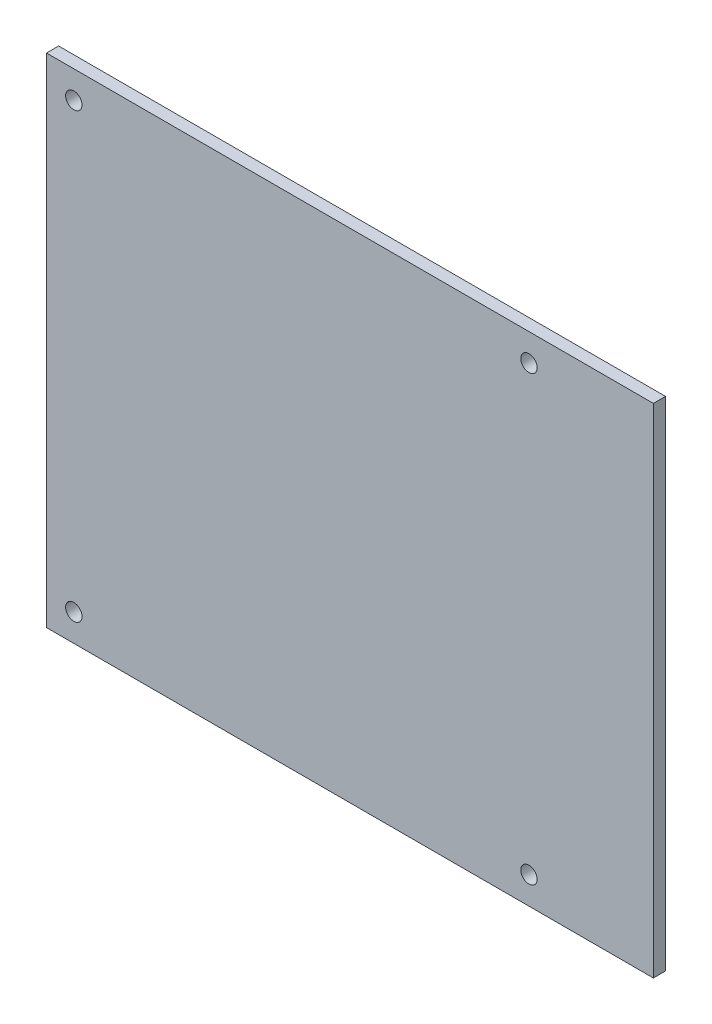
ISO-10303-21;
HEADER;
FILE_DESCRIPTION(('STEP AP214'),'2;1');
FILE_NAME('part.step','',(''),(''),'','','');
FILE_SCHEMA(('AUTOMOTIVE_DESIGN { 1 0 10303 214 1 1 1 1 }'));
ENDSEC;
DATA;
#1=APPLICATION_CONTEXT('core data for automotive mechanical design processes');
#2=APPLICATION_PROTOCOL_DEFINITION('international standard','automotive_design',2000,#1);
#3=PRODUCT_CONTEXT('',#1,'mechanical');
#4=PRODUCT('Part','Part','',(#3));
#5=PRODUCT_RELATED_PRODUCT_CATEGORY('part','',(#4));
#6=PRODUCT_DEFINITION_FORMATION('','',#4);
#7=PRODUCT_DEFINITION_CONTEXT('part definition',#1,'design');
#8=PRODUCT_DEFINITION('design','',#6,#7);
#9=PRODUCT_DEFINITION_SHAPE('','',#8);
#10=(LENGTH_UNIT() NAMED_UNIT(*) SI_UNIT(.MILLI.,.METRE.));
#11=(NAMED_UNIT(*) PLANE_ANGLE_UNIT() SI_UNIT($,.RADIAN.));
#12=(NAMED_UNIT(*) SI_UNIT($,.STERADIAN.) SOLID_ANGLE_UNIT());
#13=UNCERTAINTY_MEASURE_WITH_UNIT(LENGTH_MEASURE(1.E-05),#10,'distance_accuracy_value','');
#14=(GEOMETRIC_REPRESENTATION_CONTEXT(3) GLOBAL_UNCERTAINTY_ASSIGNED_CONTEXT((#13)) GLOBAL_UNIT_ASSIGNED_CONTEXT((#10,
#11,#12)) REPRESENTATION_CONTEXT('',''));
#15=CARTESIAN_POINT('',(0.,0.,0.));
#16=DIRECTION('',(0.,0.,1.));
#17=DIRECTION('',(1.,0.,0.));
#18=AXIS2_PLACEMENT_3D('',#15,#16,#17);
#19=CARTESIAN_POINT('',(0.,0.,52.5000000000001));
#20=DIRECTION('',(0.,0.,1.));
#21=DIRECTION('',(1.,0.,0.));
#22=AXIS2_PLACEMENT_3D('',#19,#20,#21);
#23=PLANE('',#22);
#24=CARTESIAN_POINT('',(38.8611652351687,-91.3,52.5000000000001));
#25=DIRECTION('',(0.,0.,1.));
#26=DIRECTION('',(1.,0.,0.));
#27=AXIS2_PLACEMENT_3D('',#24,#25,#26);
#28=CIRCLE('',#27,1.34999999999999);
#29=CARTESIAN_POINT('',(40.2111652351687,-91.3,52.5000000000001));
#30=VERTEX_POINT('',#29);
#31=EDGE_CURVE('E127',#30,#30,#28,.T.);
#32=ORIENTED_EDGE('',*,*,#31,.F.);
#33=EDGE_LOOP('',(#32));
#34=FACE_BOUND('',#33,.T.);
#35=CARTESIAN_POINT('',(-36.1388347648313,-91.3,52.5000000000001));
#36=DIRECTION('',(0.,0.,1.));
#37=DIRECTION('',(1.,0.,0.));
#38=AXIS2_PLACEMENT_3D('',#35,#36,#37);
#39=CIRCLE('',#38,1.34999999999999);
#40=CARTESIAN_POINT('',(-34.7888347648313,-91.3,52.5000000000001));
#41=VERTEX_POINT('',#40);
#42=EDGE_CURVE('E106',#41,#41,#39,.T.);
#43=ORIENTED_EDGE('',*,*,#42,.F.);
#44=EDGE_LOOP('',(#43));
#45=FACE_BOUND('',#44,.T.);
#46=DIRECTION('',(0.,-1.,0.));
#47=VECTOR('',#46,1.);
#48=CARTESIAN_POINT('',(-40.6388347648313,-13.8,52.5000000000001));
#49=LINE('',#48,#47);
#50=CARTESIAN_POINT('',(-40.6388347648313,-13.8,52.5000000000001));
#51=VERTEX_POINT('',#50);
#52=CARTESIAN_POINT('',(-40.6388347648313,-95.8,52.5000000000001));
#53=VERTEX_POINT('',#52);
#54=EDGE_CURVE('E91',#51,#53,#49,.T.);
#55=ORIENTED_EDGE('',*,*,#54,.T.);
#56=DIRECTION('',(1.,0.,0.));
#57=VECTOR('',#56,1.);
#58=CARTESIAN_POINT('',(-40.6388347648313,-95.8,52.5000000000001));
#59=LINE('',#58,#57);
#60=CARTESIAN_POINT('',(59.3611652351687,-95.8,52.5000000000001));
#61=VERTEX_POINT('',#60);
#62=EDGE_CURVE('E86',#53,#61,#59,.T.);
#63=ORIENTED_EDGE('',*,*,#62,.T.);
#64=DIRECTION('',(0.,1.,0.));
#65=VECTOR('',#64,1.);
#66=CARTESIAN_POINT('',(59.3611652351687,-13.8,52.5000000000001));
#67=LINE('',#66,#65);
#68=CARTESIAN_POINT('',(59.3611652351687,-13.8,52.5000000000001));
#69=VERTEX_POINT('',#68);
#70=EDGE_CURVE('E89',#61,#69,#67,.T.);
#71=ORIENTED_EDGE('',*,*,#70,.T.);
#72=DIRECTION('',(-1.,0.,0.));
#73=VECTOR('',#72,1.);
#74=CARTESIAN_POINT('',(-40.6388347648313,-13.8,52.5000000000001));
#75=LINE('',#74,#73);
#76=EDGE_CURVE('E56',#69,#51,#75,.T.);
#77=ORIENTED_EDGE('',*,*,#76,.T.);
#78=EDGE_LOOP('',(#55,#63,#71,#77));
#79=FACE_BOUND('',#78,.T.);
#80=CARTESIAN_POINT('',(-36.1388347648313,-18.3,52.5000000000001));
#81=DIRECTION('',(0.,0.,1.));
#82=DIRECTION('',(1.,0.,0.));
#83=AXIS2_PLACEMENT_3D('',#80,#81,#82);
#84=CIRCLE('',#83,1.35);
#85=CARTESIAN_POINT('',(-34.7888347648313,-18.3,52.5000000000001));
#86=VERTEX_POINT('',#85);
#87=EDGE_CURVE('E121',#86,#86,#84,.T.);
#88=ORIENTED_EDGE('',*,*,#87,.F.);
#89=EDGE_LOOP('',(#88));
#90=FACE_BOUND('',#89,.T.);
#91=CARTESIAN_POINT('',(38.8611652351687,-18.3,52.5000000000001));
#92=DIRECTION('',(0.,0.,1.));
#93=DIRECTION('',(1.,0.,0.));
#94=AXIS2_PLACEMENT_3D('',#91,#92,#93);
#95=CIRCLE('',#94,1.35);
#96=CARTESIAN_POINT('',(40.2111652351687,-18.3,52.5000000000001));
#97=VERTEX_POINT('',#96);
#98=EDGE_CURVE('E133',#97,#97,#95,.T.);
#99=ORIENTED_EDGE('',*,*,#98,.F.);
#100=EDGE_LOOP('',(#99));
#101=FACE_BOUND('',#100,.T.);
#102=ADVANCED_FACE('F39',(#34,#45,#79,#90,#101),#23,.T.);
#103=CARTESIAN_POINT('',(0.,0.,50.5));
#104=DIRECTION('',(0.,0.,1.));
#105=DIRECTION('',(1.,0.,0.));
#106=AXIS2_PLACEMENT_3D('',#103,#104,#105);
#107=PLANE('',#106);
#108=DIRECTION('',(0.,-1.,0.));
#109=VECTOR('',#108,1.);
#110=CARTESIAN_POINT('',(-40.6388347648313,-13.8,50.5));
#111=LINE('',#110,#109);
#112=CARTESIAN_POINT('',(-40.6388347648313,-13.8,50.5));
#113=VERTEX_POINT('',#112);
#114=CARTESIAN_POINT('',(-40.6388347648313,-95.8,50.5));
#115=VERTEX_POINT('',#114);
#116=EDGE_CURVE('E103',#113,#115,#111,.T.);
#117=ORIENTED_EDGE('',*,*,#116,.F.);
#118=DIRECTION('',(-1.,0.,0.));
#119=VECTOR('',#118,1.);
#120=CARTESIAN_POINT('',(-40.6388347648313,-13.8,50.5));
#121=LINE('',#120,#119);
#122=CARTESIAN_POINT('',(59.3611652351687,-13.8,50.5));
#123=VERTEX_POINT('',#122);
#124=EDGE_CURVE('E79',#123,#113,#121,.T.);
#125=ORIENTED_EDGE('',*,*,#124,.F.);
#126=DIRECTION('',(0.,1.,0.));
#127=VECTOR('',#126,1.);
#128=CARTESIAN_POINT('',(59.3611652351687,-13.8,50.5));
#129=LINE('',#128,#127);
#130=CARTESIAN_POINT('',(59.3611652351687,-95.8,50.5));
#131=VERTEX_POINT('',#130);
#132=EDGE_CURVE('E73',#131,#123,#129,.T.);
#133=ORIENTED_EDGE('',*,*,#132,.F.);
#134=DIRECTION('',(1.,0.,0.));
#135=VECTOR('',#134,1.);
#136=CARTESIAN_POINT('',(-40.6388347648313,-95.8,50.5));
#137=LINE('',#136,#135);
#138=EDGE_CURVE('E95',#115,#131,#137,.T.);
#139=ORIENTED_EDGE('',*,*,#138,.F.);
#140=EDGE_LOOP('',(#117,#125,#133,#139));
#141=FACE_BOUND('',#140,.T.);
#142=CARTESIAN_POINT('',(-36.1388347648313,-91.3,50.5));
#143=DIRECTION('',(0.,0.,1.));
#144=DIRECTION('',(1.,0.,0.));
#145=AXIS2_PLACEMENT_3D('',#142,#143,#144);
#146=CIRCLE('',#145,1.34999999999999);
#147=CARTESIAN_POINT('',(-34.7888347648313,-91.3,50.5));
#148=VERTEX_POINT('',#147);
#149=EDGE_CURVE('E118',#148,#148,#146,.T.);
#150=ORIENTED_EDGE('',*,*,#149,.T.);
#151=EDGE_LOOP('',(#150));
#152=FACE_BOUND('',#151,.T.);
#153=CARTESIAN_POINT('',(-36.1388347648313,-18.3,50.5));
#154=DIRECTION('',(0.,0.,1.));
#155=DIRECTION('',(1.,0.,0.));
#156=AXIS2_PLACEMENT_3D('',#153,#154,#155);
#157=CIRCLE('',#156,1.35);
#158=CARTESIAN_POINT('',(-34.7888347648313,-18.3,50.5));
#159=VERTEX_POINT('',#158);
#160=EDGE_CURVE('E124',#159,#159,#157,.T.);
#161=ORIENTED_EDGE('',*,*,#160,.T.);
#162=EDGE_LOOP('',(#161));
#163=FACE_BOUND('',#162,.T.);
#164=CARTESIAN_POINT('',(38.8611652351687,-91.3,50.5));
#165=DIRECTION('',(0.,0.,1.));
#166=DIRECTION('',(1.,0.,0.));
#167=AXIS2_PLACEMENT_3D('',#164,#165,#166);
#168=CIRCLE('',#167,1.34999999999999);
#169=CARTESIAN_POINT('',(40.2111652351687,-91.3,50.5));
#170=VERTEX_POINT('',#169);
#171=EDGE_CURVE('E130',#170,#170,#168,.T.);
#172=ORIENTED_EDGE('',*,*,#171,.T.);
#173=EDGE_LOOP('',(#172));
#174=FACE_BOUND('',#173,.T.);
#175=CARTESIAN_POINT('',(38.8611652351687,-18.3,50.5));
#176=DIRECTION('',(0.,0.,1.));
#177=DIRECTION('',(1.,0.,0.));
#178=AXIS2_PLACEMENT_3D('',#175,#176,#177);
#179=CIRCLE('',#178,1.35);
#180=CARTESIAN_POINT('',(40.2111652351687,-18.3,50.5));
#181=VERTEX_POINT('',#180);
#182=EDGE_CURVE('E136',#181,#181,#179,.T.);
#183=ORIENTED_EDGE('',*,*,#182,.T.);
#184=EDGE_LOOP('',(#183));
#185=FACE_BOUND('',#184,.T.);
#186=ADVANCED_FACE('F114',(#141,#152,#163,#174,#185),#107,.F.);
#187=CARTESIAN_POINT('',(-40.6388347648313,-13.8,52.5000000000001));
#188=DIRECTION('',(1.,0.,0.));
#189=DIRECTION('',(0.,0.,-1.));
#190=AXIS2_PLACEMENT_3D('',#187,#188,#189);
#191=PLANE('',#190);
#192=ORIENTED_EDGE('',*,*,#116,.T.);
#193=DIRECTION('',(0.,0.,-1.));
#194=VECTOR('',#193,1.);
#195=CARTESIAN_POINT('',(-40.6388347648313,-95.8,52.5000000000001));
#196=LINE('',#195,#194);
#197=EDGE_CURVE('E11',#53,#115,#196,.T.);
#198=ORIENTED_EDGE('',*,*,#197,.F.);
#199=ORIENTED_EDGE('',*,*,#54,.F.);
#200=DIRECTION('',(0.,0.,-1.));
#201=VECTOR('',#200,1.);
#202=CARTESIAN_POINT('',(-40.6388347648313,-13.8,52.5000000000001));
#203=LINE('',#202,#201);
#204=EDGE_CURVE('E99',#51,#113,#203,.T.);
#205=ORIENTED_EDGE('',*,*,#204,.T.);
#206=EDGE_LOOP('',(#192,#198,#199,#205));
#207=FACE_BOUND('',#206,.T.);
#208=ADVANCED_FACE('F41',(#207),#191,.F.);
#209=CARTESIAN_POINT('',(-40.6388347648313,-95.8,52.5000000000001));
#210=DIRECTION('',(0.,1.,0.));
#211=DIRECTION('',(0.,0.,1.));
#212=AXIS2_PLACEMENT_3D('',#209,#210,#211);
#213=PLANE('',#212);
#214=ORIENTED_EDGE('',*,*,#138,.T.);
#215=DIRECTION('',(0.,0.,-1.));
#216=VECTOR('',#215,1.);
#217=CARTESIAN_POINT('',(59.3611652351687,-95.8,52.5000000000001));
#218=LINE('',#217,#216);
#219=EDGE_CURVE('E48',#61,#131,#218,.T.);
#220=ORIENTED_EDGE('',*,*,#219,.F.);
#221=ORIENTED_EDGE('',*,*,#62,.F.);
#222=ORIENTED_EDGE('',*,*,#197,.T.);
#223=EDGE_LOOP('',(#214,#220,#221,#222));
#224=FACE_BOUND('',#223,.T.);
#225=ADVANCED_FACE('F94',(#224),#213,.F.);
#226=CARTESIAN_POINT('',(59.3611652351687,-13.8,52.5000000000001));
#227=DIRECTION('',(-1.,0.,0.));
#228=DIRECTION('',(0.,0.,1.));
#229=AXIS2_PLACEMENT_3D('',#226,#227,#228);
#230=PLANE('',#229);
#231=ORIENTED_EDGE('',*,*,#132,.T.);
#232=DIRECTION('',(0.,0.,-1.));
#233=VECTOR('',#232,1.);
#234=CARTESIAN_POINT('',(59.3611652351687,-13.8,52.5000000000001));
#235=LINE('',#234,#233);
#236=EDGE_CURVE('E96',#69,#123,#235,.T.);
#237=ORIENTED_EDGE('',*,*,#236,.F.);
#238=ORIENTED_EDGE('',*,*,#70,.F.);
#239=ORIENTED_EDGE('',*,*,#219,.T.);
#240=EDGE_LOOP('',(#231,#237,#238,#239));
#241=FACE_BOUND('',#240,.T.);
#242=ADVANCED_FACE('F97',(#241),#230,.F.);
#243=CARTESIAN_POINT('',(-40.6388347648313,-13.8,52.5000000000001));
#244=DIRECTION('',(0.,-1.,0.));
#245=DIRECTION('',(0.,0.,-1.));
#246=AXIS2_PLACEMENT_3D('',#243,#244,#245);
#247=PLANE('',#246);
#248=ORIENTED_EDGE('',*,*,#124,.T.);
#249=ORIENTED_EDGE('',*,*,#204,.F.);
#250=ORIENTED_EDGE('',*,*,#76,.F.);
#251=ORIENTED_EDGE('',*,*,#236,.T.);
#252=EDGE_LOOP('',(#248,#249,#250,#251));
#253=FACE_BOUND('',#252,.T.);
#254=ADVANCED_FACE('F111',(#253),#247,.F.);
#255=CARTESIAN_POINT('',(-36.1388347648313,-91.3,52.5000000000001));
#256=DIRECTION('',(0.,0.,-1.));
#257=DIRECTION('',(-1.,0.,0.));
#258=AXIS2_PLACEMENT_3D('',#255,#256,#257);
#259=CYLINDRICAL_SURFACE('',#258,1.34999999999999);
#260=ORIENTED_EDGE('',*,*,#42,.T.);
#261=EDGE_LOOP('',(#260));
#262=FACE_BOUND('',#261,.T.);
#263=ORIENTED_EDGE('',*,*,#149,.F.);
#264=EDGE_LOOP('',(#263));
#265=FACE_BOUND('',#264,.T.);
#266=ADVANCED_FACE('F155',(#262,#265),#259,.F.);
#267=CARTESIAN_POINT('',(-36.1388347648313,-18.3,52.5000000000001));
#268=DIRECTION('',(0.,0.,-1.));
#269=DIRECTION('',(-1.,0.,0.));
#270=AXIS2_PLACEMENT_3D('',#267,#268,#269);
#271=CYLINDRICAL_SURFACE('',#270,1.35);
#272=ORIENTED_EDGE('',*,*,#87,.T.);
#273=EDGE_LOOP('',(#272));
#274=FACE_BOUND('',#273,.T.);
#275=ORIENTED_EDGE('',*,*,#160,.F.);
#276=EDGE_LOOP('',(#275));
#277=FACE_BOUND('',#276,.T.);
#278=ADVANCED_FACE('F200',(#274,#277),#271,.F.);
#279=CARTESIAN_POINT('',(38.8611652351687,-91.3,52.5000000000001));
#280=DIRECTION('',(0.,0.,-1.));
#281=DIRECTION('',(-1.,0.,0.));
#282=AXIS2_PLACEMENT_3D('',#279,#280,#281);
#283=CYLINDRICAL_SURFACE('',#282,1.34999999999999);
#284=ORIENTED_EDGE('',*,*,#31,.T.);
#285=EDGE_LOOP('',(#284));
#286=FACE_BOUND('',#285,.T.);
#287=ORIENTED_EDGE('',*,*,#171,.F.);
#288=EDGE_LOOP('',(#287));
#289=FACE_BOUND('',#288,.T.);
#290=ADVANCED_FACE('F208',(#286,#289),#283,.F.);
#291=CARTESIAN_POINT('',(38.8611652351687,-18.3,52.5000000000001));
#292=DIRECTION('',(0.,0.,-1.));
#293=DIRECTION('',(-1.,0.,0.));
#294=AXIS2_PLACEMENT_3D('',#291,#292,#293);
#295=CYLINDRICAL_SURFACE('',#294,1.35);
#296=ORIENTED_EDGE('',*,*,#98,.T.);
#297=EDGE_LOOP('',(#296));
#298=FACE_BOUND('',#297,.T.);
#299=ORIENTED_EDGE('',*,*,#182,.F.);
#300=EDGE_LOOP('',(#299));
#301=FACE_BOUND('',#300,.T.);
#302=ADVANCED_FACE('F142',(#298,#301),#295,.F.);
#303=CLOSED_SHELL('',(#102,#186,#208,#225,#242,#254,#266,#278,#290,#302));
#304=MANIFOLD_SOLID_BREP('B2',#303);
#305=ADVANCED_BREP_SHAPE_REPRESENTATION('',(#18,#304),#14);
#306=SHAPE_DEFINITION_REPRESENTATION(#9,#305);
ENDSEC;
END-ISO-10303-21;
